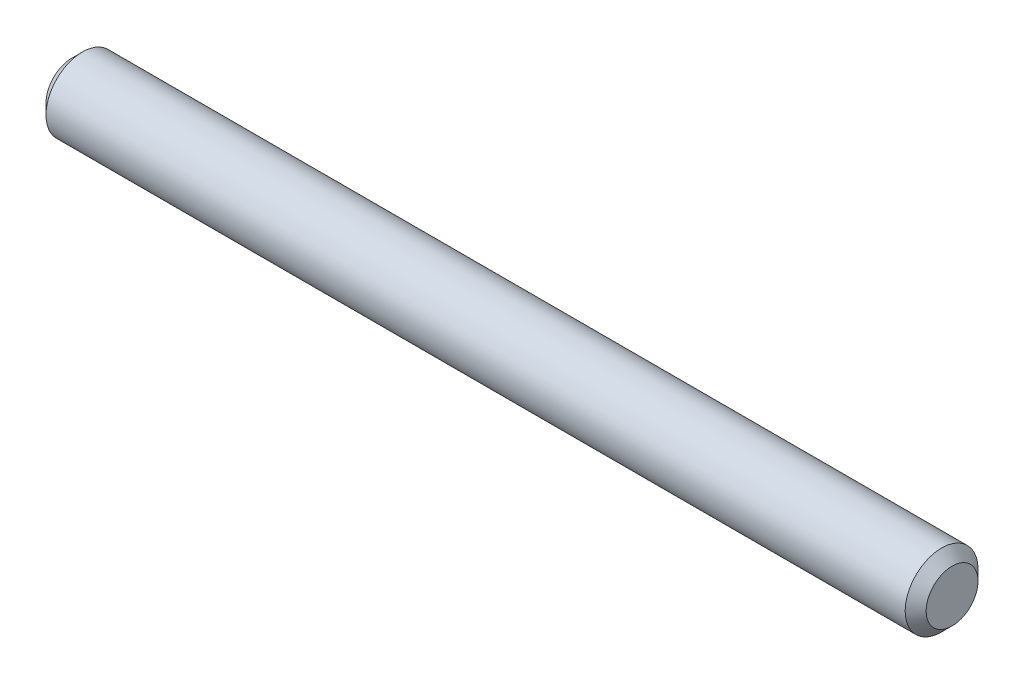
ISO-10303-21;
HEADER;
FILE_DESCRIPTION(('STEP AP214'),'2;1');
FILE_NAME('part.step','',(''),(''),'','','');
FILE_SCHEMA(('AUTOMOTIVE_DESIGN { 1 0 10303 214 1 1 1 1 }'));
ENDSEC;
DATA;
#1=APPLICATION_CONTEXT('core data for automotive mechanical design processes');
#2=APPLICATION_PROTOCOL_DEFINITION('international standard','automotive_design',2000,#1);
#3=PRODUCT_CONTEXT('',#1,'mechanical');
#4=PRODUCT('Part','Part','',(#3));
#5=PRODUCT_RELATED_PRODUCT_CATEGORY('part','',(#4));
#6=PRODUCT_DEFINITION_FORMATION('','',#4);
#7=PRODUCT_DEFINITION_CONTEXT('part definition',#1,'design');
#8=PRODUCT_DEFINITION('design','',#6,#7);
#9=PRODUCT_DEFINITION_SHAPE('','',#8);
#10=(LENGTH_UNIT() NAMED_UNIT(*) SI_UNIT(.MILLI.,.METRE.));
#11=(NAMED_UNIT(*) PLANE_ANGLE_UNIT() SI_UNIT($,.RADIAN.));
#12=(NAMED_UNIT(*) SI_UNIT($,.STERADIAN.) SOLID_ANGLE_UNIT());
#13=UNCERTAINTY_MEASURE_WITH_UNIT(LENGTH_MEASURE(1.E-05),#10,'distance_accuracy_value','');
#14=(GEOMETRIC_REPRESENTATION_CONTEXT(3) GLOBAL_UNCERTAINTY_ASSIGNED_CONTEXT((#13)) GLOBAL_UNIT_ASSIGNED_CONTEXT((#10,
#11,#12)) REPRESENTATION_CONTEXT('',''));
#15=CARTESIAN_POINT('',(0.,0.,0.));
#16=DIRECTION('',(0.,0.,1.));
#17=DIRECTION('',(1.,0.,0.));
#18=AXIS2_PLACEMENT_3D('',#15,#16,#17);
#19=CARTESIAN_POINT('',(42.,0.,0.));
#20=DIRECTION('',(-1.,0.,0.));
#21=DIRECTION('',(0.,0.,1.));
#22=AXIS2_PLACEMENT_3D('',#19,#20,#21);
#23=CYLINDRICAL_SURFACE('',#22,3.475);
#24=CARTESIAN_POINT('',(41.,0.,0.));
#25=DIRECTION('',(1.,0.,0.));
#26=DIRECTION('',(0.,0.,-1.));
#27=AXIS2_PLACEMENT_3D('',#24,#25,#26);
#28=CIRCLE('',#27,3.475);
#29=CARTESIAN_POINT('',(41.,0.,3.475));
#30=VERTEX_POINT('',#29);
#31=EDGE_CURVE('E41',#30,#30,#28,.F.);
#32=CARTESIAN_POINT('',(-41.,0.,0.));
#33=DIRECTION('',(1.,0.,0.));
#34=DIRECTION('',(0.,0.,-1.));
#35=AXIS2_PLACEMENT_3D('',#32,#33,#34);
#36=CIRCLE('',#35,3.475);
#37=CARTESIAN_POINT('',(-41.,0.,3.475));
#38=VERTEX_POINT('',#37);
#39=EDGE_CURVE('E45',#38,#38,#36,.T.);
#40=CARTESIAN_POINT('',(41.,0.,3.475));
#41=CARTESIAN_POINT('',(40.1458333333334,0.,3.475));
#42=CARTESIAN_POINT('',(39.2916666666667,0.,3.475));
#43=CARTESIAN_POINT('',(37.5833333333334,0.,3.475));
#44=CARTESIAN_POINT('',(36.7291666666667,0.,3.475));
#45=CARTESIAN_POINT('',(35.0208333333334,0.,3.475));
#46=CARTESIAN_POINT('',(34.1666666666667,0.,3.475));
#47=CARTESIAN_POINT('',(32.4583333333334,0.,3.475));
#48=CARTESIAN_POINT('',(31.6041666666667,0.,3.475));
#49=CARTESIAN_POINT('',(29.8958333333334,0.,3.475));
#50=CARTESIAN_POINT('',(29.0416666666667,0.,3.475));
#51=CARTESIAN_POINT('',(27.3333333333334,0.,3.475));
#52=CARTESIAN_POINT('',(26.4791666666667,0.,3.475));
#53=CARTESIAN_POINT('',(24.7708333333334,0.,3.475));
#54=CARTESIAN_POINT('',(23.9166666666667,0.,3.475));
#55=CARTESIAN_POINT('',(22.2083333333334,0.,3.475));
#56=CARTESIAN_POINT('',(21.3541666666667,0.,3.475));
#57=CARTESIAN_POINT('',(19.6458333333334,0.,3.475));
#58=CARTESIAN_POINT('',(18.7916666666667,0.,3.475));
#59=CARTESIAN_POINT('',(17.0833333333334,0.,3.475));
#60=CARTESIAN_POINT('',(16.2291666666667,0.,3.475));
#61=CARTESIAN_POINT('',(14.5208333333334,0.,3.475));
#62=CARTESIAN_POINT('',(13.6666666666667,0.,3.475));
#63=CARTESIAN_POINT('',(11.9583333333334,0.,3.475));
#64=CARTESIAN_POINT('',(11.1041666666667,0.,3.475));
#65=CARTESIAN_POINT('',(9.39583333333336,0.,3.475));
#66=CARTESIAN_POINT('',(8.54166666666669,0.,3.475));
#67=CARTESIAN_POINT('',(6.83333333333336,0.,3.475));
#68=CARTESIAN_POINT('',(5.9791666666667,0.,3.475));
#69=CARTESIAN_POINT('',(4.27083333333336,0.,3.475));
#70=CARTESIAN_POINT('',(3.41666666666669,0.,3.475));
#71=CARTESIAN_POINT('',(1.70833333333336,0.,3.475));
#72=CARTESIAN_POINT('',(0.854166666666693,0.,3.475));
#73=CARTESIAN_POINT('',(-0.854166666666642,0.,3.475));
#74=CARTESIAN_POINT('',(-1.70833333333331,0.,3.475));
#75=CARTESIAN_POINT('',(-3.41666666666665,0.,3.475));
#76=CARTESIAN_POINT('',(-4.27083333333331,0.,3.475));
#77=CARTESIAN_POINT('',(-5.97916666666664,0.,3.475));
#78=CARTESIAN_POINT('',(-6.83333333333331,0.,3.475));
#79=CARTESIAN_POINT('',(-8.54166666666664,0.,3.475));
#80=CARTESIAN_POINT('',(-9.39583333333331,0.,3.475));
#81=CARTESIAN_POINT('',(-11.1041666666666,0.,3.475));
#82=CARTESIAN_POINT('',(-11.9583333333333,0.,3.475));
#83=CARTESIAN_POINT('',(-13.6666666666666,0.,3.475));
#84=CARTESIAN_POINT('',(-14.5208333333333,0.,3.475));
#85=CARTESIAN_POINT('',(-16.2291666666666,0.,3.475));
#86=CARTESIAN_POINT('',(-17.0833333333333,0.,3.475));
#87=CARTESIAN_POINT('',(-18.7916666666666,0.,3.475));
#88=CARTESIAN_POINT('',(-19.6458333333333,0.,3.475));
#89=CARTESIAN_POINT('',(-21.3541666666666,0.,3.475));
#90=CARTESIAN_POINT('',(-22.2083333333333,0.,3.475));
#91=CARTESIAN_POINT('',(-23.9166666666666,0.,3.475));
#92=CARTESIAN_POINT('',(-24.7708333333333,0.,3.475));
#93=CARTESIAN_POINT('',(-26.4791666666666,0.,3.475));
#94=CARTESIAN_POINT('',(-27.3333333333333,0.,3.475));
#95=CARTESIAN_POINT('',(-29.0416666666666,0.,3.475));
#96=CARTESIAN_POINT('',(-29.8958333333333,0.,3.475));
#97=CARTESIAN_POINT('',(-31.6041666666666,0.,3.475));
#98=CARTESIAN_POINT('',(-32.4583333333333,0.,3.475));
#99=CARTESIAN_POINT('',(-34.1666666666666,0.,3.475));
#100=CARTESIAN_POINT('',(-35.0208333333333,0.,3.475));
#101=CARTESIAN_POINT('',(-36.7291666666666,0.,3.475));
#102=CARTESIAN_POINT('',(-37.5833333333333,0.,3.475));
#103=CARTESIAN_POINT('',(-39.2916666666666,0.,3.475));
#104=CARTESIAN_POINT('',(-40.1458333333333,0.,3.475));
#105=CARTESIAN_POINT('',(-41.,0.,3.475));
#106=B_SPLINE_CURVE_WITH_KNOTS('',3,(#40,#41,#42,#43,#44,#45,#46,#47,#48,#49,#50,#51,#52,#53,
#54,#55,#56,#57,#58,#59,#60,#61,#62,#63,#64,#65,#66,#67,#68,#69,#70,#71,#72,#73,#74,#75,#76,#77,
#78,#79,#80,#81,#82,#83,#84,#85,#86,#87,#88,#89,#90,#91,#92,#93,#94,#95,#96,#97,#98,#99,#100,
#101,#102,#103,#104,#105),.UNSPECIFIED.,.F.,.F.,(4,2,2,2,2,2,2,2,2,2,2,2,2,2,2,2,2,2,2,2,2,2,2,
2,2,2,2,2,2,2,2,2,4),(0.,2.5625,5.125,7.68750000000001,10.25,12.8125,15.375,17.9375,20.5,
23.0625,25.625,28.1875,30.75,33.3125,35.875,38.4375,41.,43.5625,46.125,48.6875,51.25,53.8125,
56.375,58.9375,61.5,64.0625,66.625,69.1875,71.75,74.3125,76.875,79.4375,82.),.UNSPECIFIED.);
#107=EDGE_CURVE('BSEAM33',#30,#38,#106,.T.);
#108=ORIENTED_EDGE('',*,*,#31,.T.);
#109=ORIENTED_EDGE('',*,*,#39,.T.);
#110=ORIENTED_EDGE('',*,*,#107,.T.);
#111=ORIENTED_EDGE('',*,*,#107,.F.);
#112=EDGE_LOOP('',(#108,#110,#109,#111));
#113=FACE_BOUND('',#112,.T.);
#114=ADVANCED_FACE('F33',(#113),#23,.T.);
#115=CARTESIAN_POINT('',(42.,0.,0.));
#116=DIRECTION('',(1.,0.,0.));
#117=DIRECTION('',(0.,0.,-1.));
#118=AXIS2_PLACEMENT_3D('',#115,#116,#117);
#119=PLANE('',#118);
#120=CARTESIAN_POINT('',(42.,0.,0.));
#121=DIRECTION('',(1.,0.,0.));
#122=DIRECTION('',(0.,0.,-1.));
#123=AXIS2_PLACEMENT_3D('',#120,#121,#122);
#124=CIRCLE('',#123,2.47500000000003);
#125=CARTESIAN_POINT('',(42.,0.,-2.47500000000003));
#126=VERTEX_POINT('',#125);
#127=EDGE_CURVE('E49',#126,#126,#124,.T.);
#128=ORIENTED_EDGE('',*,*,#127,.T.);
#129=EDGE_LOOP('',(#128));
#130=FACE_BOUND('',#129,.T.);
#131=ADVANCED_FACE('F55',(#130),#119,.T.);
#132=CARTESIAN_POINT('',(-42.,0.,0.));
#133=DIRECTION('',(1.,0.,0.));
#134=DIRECTION('',(0.,0.,-1.));
#135=AXIS2_PLACEMENT_3D('',#132,#133,#134);
#136=PLANE('',#135);
#137=CARTESIAN_POINT('',(-42.,0.,0.));
#138=DIRECTION('',(1.,0.,0.));
#139=DIRECTION('',(0.,0.,-1.));
#140=AXIS2_PLACEMENT_3D('',#137,#138,#139);
#141=CIRCLE('',#140,2.47499999999994);
#142=CARTESIAN_POINT('',(-42.,0.,-2.47499999999994));
#143=VERTEX_POINT('',#142);
#144=EDGE_CURVE('E10',#143,#143,#141,.F.);
#145=ORIENTED_EDGE('',*,*,#144,.T.);
#146=EDGE_LOOP('',(#145));
#147=FACE_BOUND('',#146,.T.);
#148=ADVANCED_FACE('F59',(#147),#136,.F.);
#149=CARTESIAN_POINT('',(42.,0.,0.));
#150=DIRECTION('',(-1.,0.,0.));
#151=DIRECTION('',(0.,0.,1.));
#152=AXIS2_PLACEMENT_3D('',#149,#150,#151);
#153=CONICAL_SURFACE('',#152,2.47500000000003,0.785398163397446);
#154=ORIENTED_EDGE('',*,*,#31,.F.);
#155=EDGE_LOOP('',(#154));
#156=FACE_BOUND('',#155,.T.);
#157=ORIENTED_EDGE('',*,*,#127,.F.);
#158=EDGE_LOOP('',(#157));
#159=FACE_BOUND('',#158,.T.);
#160=ADVANCED_FACE('F57',(#156,#159),#153,.T.);
#161=CARTESIAN_POINT('',(-41.,0.,0.));
#162=DIRECTION('',(1.,0.,0.));
#163=DIRECTION('',(0.,0.,-1.));
#164=AXIS2_PLACEMENT_3D('',#161,#162,#163);
#165=CONICAL_SURFACE('',#164,3.475,0.78539816339746);
#166=ORIENTED_EDGE('',*,*,#144,.F.);
#167=EDGE_LOOP('',(#166));
#168=FACE_BOUND('',#167,.T.);
#169=ORIENTED_EDGE('',*,*,#39,.F.);
#170=EDGE_LOOP('',(#169));
#171=FACE_BOUND('',#170,.T.);
#172=ADVANCED_FACE('F36',(#168,#171),#165,.T.);
#173=CLOSED_SHELL('',(#114,#131,#148,#160,#172));
#174=MANIFOLD_SOLID_BREP('B2',#173);
#175=ADVANCED_BREP_SHAPE_REPRESENTATION('',(#18,#174),#14);
#176=SHAPE_DEFINITION_REPRESENTATION(#9,#175);
ENDSEC;
END-ISO-10303-21;
